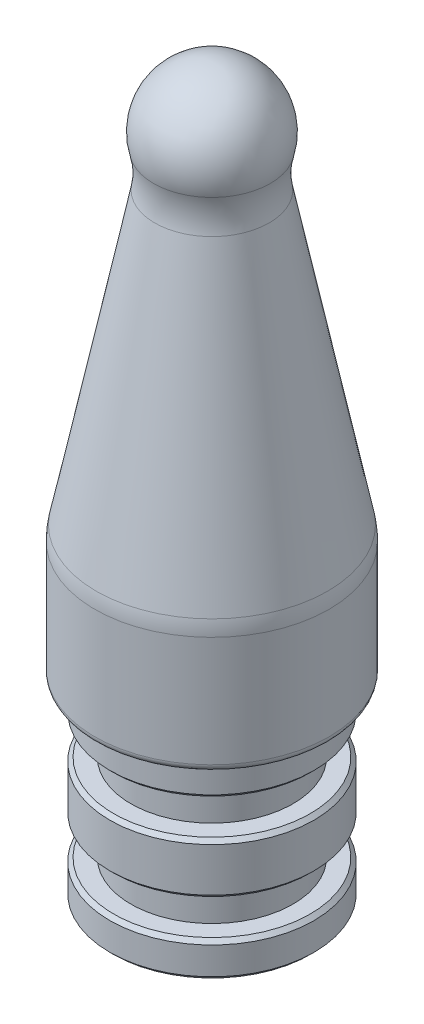
ISO-10303-21;
HEADER;
FILE_DESCRIPTION(('STEP AP214'),'2;1');
FILE_NAME('part.step','',(''),(''),'','','');
FILE_SCHEMA(('AUTOMOTIVE_DESIGN { 1 0 10303 214 1 1 1 1 }'));
ENDSEC;
DATA;
#1=APPLICATION_CONTEXT('core data for automotive mechanical design processes');
#2=APPLICATION_PROTOCOL_DEFINITION('international standard','automotive_design',2000,#1);
#3=PRODUCT_CONTEXT('',#1,'mechanical');
#4=PRODUCT('Part','Part','',(#3));
#5=PRODUCT_RELATED_PRODUCT_CATEGORY('part','',(#4));
#6=PRODUCT_DEFINITION_FORMATION('','',#4);
#7=PRODUCT_DEFINITION_CONTEXT('part definition',#1,'design');
#8=PRODUCT_DEFINITION('design','',#6,#7);
#9=PRODUCT_DEFINITION_SHAPE('','',#8);
#10=(LENGTH_UNIT() NAMED_UNIT(*) SI_UNIT(.MILLI.,.METRE.));
#11=(NAMED_UNIT(*) PLANE_ANGLE_UNIT() SI_UNIT($,.RADIAN.));
#12=(NAMED_UNIT(*) SI_UNIT($,.STERADIAN.) SOLID_ANGLE_UNIT());
#13=UNCERTAINTY_MEASURE_WITH_UNIT(LENGTH_MEASURE(1.E-05),#10,'distance_accuracy_value','');
#14=(GEOMETRIC_REPRESENTATION_CONTEXT(3) GLOBAL_UNCERTAINTY_ASSIGNED_CONTEXT((#13)) GLOBAL_UNIT_ASSIGNED_CONTEXT((#10,
#11,#12)) REPRESENTATION_CONTEXT('',''));
#15=CARTESIAN_POINT('',(0.,0.,0.));
#16=DIRECTION('',(0.,0.,1.));
#17=DIRECTION('',(1.,0.,0.));
#18=AXIS2_PLACEMENT_3D('',#15,#16,#17);
#19=CARTESIAN_POINT('',(0.,0.,0.));
#20=DIRECTION('',(0.,1.,0.));
#21=DIRECTION('',(0.,0.,1.));
#22=AXIS2_PLACEMENT_3D('',#19,#20,#21);
#23=PLANE('',#22);
#24=CARTESIAN_POINT('',(0.,0.,0.));
#25=DIRECTION('',(0.,1.,0.));
#26=DIRECTION('',(0.,0.,1.));
#27=AXIS2_PLACEMENT_3D('',#24,#25,#26);
#28=CIRCLE('',#27,13.);
#29=CARTESIAN_POINT('',(0.,0.,13.));
#30=VERTEX_POINT('',#29);
#31=EDGE_CURVE('E71',#30,#30,#28,.F.);
#32=ORIENTED_EDGE('',*,*,#31,.T.);
#33=EDGE_LOOP('',(#32));
#34=FACE_BOUND('',#33,.T.);
#35=CARTESIAN_POINT('',(0.,0.,0.));
#36=DIRECTION('',(0.,-1.,0.));
#37=DIRECTION('',(0.,0.,-1.));
#38=AXIS2_PLACEMENT_3D('',#35,#36,#37);
#39=CIRCLE('',#38,2.09999999999999);
#40=CARTESIAN_POINT('',(0.,0.,-2.09999999999999));
#41=VERTEX_POINT('',#40);
#42=EDGE_CURVE('E119',#41,#41,#39,.T.);
#43=ORIENTED_EDGE('',*,*,#42,.F.);
#44=EDGE_LOOP('',(#43));
#45=FACE_BOUND('',#44,.T.);
#46=ADVANCED_FACE('F45',(#34,#45),#23,.F.);
#47=CARTESIAN_POINT('',(0.,-29.1154086371947,0.));
#48=DIRECTION('',(0.,-1.,0.));
#49=DIRECTION('',(0.,0.,-1.));
#50=AXIS2_PLACEMENT_3D('',#47,#48,#49);
#51=CYLINDRICAL_SURFACE('',#50,13.5);
#52=CARTESIAN_POINT('',(0.,21.34,0.));
#53=DIRECTION('',(0.,1.,0.));
#54=DIRECTION('',(0.,0.,1.));
#55=AXIS2_PLACEMENT_3D('',#52,#53,#54);
#56=CIRCLE('',#55,13.5);
#57=CARTESIAN_POINT('',(0.,21.34,13.5));
#58=VERTEX_POINT('',#57);
#59=EDGE_CURVE('E95',#58,#58,#56,.T.);
#60=ORIENTED_EDGE('',*,*,#59,.T.);
#61=EDGE_LOOP('',(#60));
#62=FACE_BOUND('',#61,.T.);
#63=CARTESIAN_POINT('',(0.,25.1999999999997,0.));
#64=DIRECTION('',(0.,-1.,0.));
#65=DIRECTION('',(1.,0.,0.));
#66=AXIS2_PLACEMENT_3D('',#63,#64,#65);
#67=CIRCLE('',#66,13.5);
#68=CARTESIAN_POINT('',(13.5,25.1999999999997,0.));
#69=VERTEX_POINT('',#68);
#70=EDGE_CURVE('E113',#69,#69,#67,.T.);
#71=ORIENTED_EDGE('',*,*,#70,.T.);
#72=EDGE_LOOP('',(#71));
#73=FACE_BOUND('',#72,.T.);
#74=ADVANCED_FACE('F126',(#62,#73),#51,.T.);
#75=CARTESIAN_POINT('',(-13.5,20.84,0.));
#76=DIRECTION('',(0.,1.,0.));
#77=DIRECTION('',(0.,0.,1.));
#78=AXIS2_PLACEMENT_3D('',#75,#76,#77);
#79=PLANE('',#78);
#80=CARTESIAN_POINT('',(0.,20.84,0.));
#81=DIRECTION('',(0.,1.,0.));
#82=DIRECTION('',(0.,0.,1.));
#83=AXIS2_PLACEMENT_3D('',#80,#81,#82);
#84=CIRCLE('',#83,13.);
#85=CARTESIAN_POINT('',(0.,20.84,13.));
#86=VERTEX_POINT('',#85);
#87=EDGE_CURVE('E98',#86,#86,#84,.F.);
#88=ORIENTED_EDGE('',*,*,#87,.T.);
#89=EDGE_LOOP('',(#88));
#90=FACE_BOUND('',#89,.T.);
#91=CARTESIAN_POINT('',(0.,20.84,0.));
#92=DIRECTION('',(0.,-1.,0.));
#93=DIRECTION('',(0.,0.,-1.));
#94=AXIS2_PLACEMENT_3D('',#91,#92,#93);
#95=CIRCLE('',#94,10.73);
#96=CARTESIAN_POINT('',(0.,20.84,-10.73));
#97=VERTEX_POINT('',#96);
#98=EDGE_CURVE('E101',#97,#97,#95,.T.);
#99=ORIENTED_EDGE('',*,*,#98,.F.);
#100=EDGE_LOOP('',(#99));
#101=FACE_BOUND('',#100,.T.);
#102=ADVANCED_FACE('F132',(#90,#101),#79,.F.);
#103=CARTESIAN_POINT('',(0.,-29.1154086371947,0.));
#104=DIRECTION('',(0.,-1.,0.));
#105=DIRECTION('',(0.,0.,-1.));
#106=AXIS2_PLACEMENT_3D('',#103,#104,#105);
#107=CYLINDRICAL_SURFACE('',#106,10.73);
#108=CARTESIAN_POINT('',(0.,16.14,0.));
#109=DIRECTION('',(0.,-1.,0.));
#110=DIRECTION('',(0.,0.,-1.));
#111=AXIS2_PLACEMENT_3D('',#108,#109,#110);
#112=CIRCLE('',#111,10.73);
#113=CARTESIAN_POINT('',(0.,16.14,-10.73));
#114=VERTEX_POINT('',#113);
#115=EDGE_CURVE('E104',#114,#114,#112,.T.);
#116=ORIENTED_EDGE('',*,*,#115,.F.);
#117=EDGE_LOOP('',(#116));
#118=FACE_BOUND('',#117,.T.);
#119=ORIENTED_EDGE('',*,*,#98,.T.);
#120=EDGE_LOOP('',(#119));
#121=FACE_BOUND('',#120,.T.);
#122=ADVANCED_FACE('F163',(#118,#121),#107,.T.);
#123=CARTESIAN_POINT('',(-10.73,16.14,0.));
#124=DIRECTION('',(0.,-1.,0.));
#125=DIRECTION('',(0.,0.,-1.));
#126=AXIS2_PLACEMENT_3D('',#123,#124,#125);
#127=PLANE('',#126);
#128=CARTESIAN_POINT('',(0.,16.14,0.));
#129=DIRECTION('',(0.,-1.,0.));
#130=DIRECTION('',(0.,0.,-1.));
#131=AXIS2_PLACEMENT_3D('',#128,#129,#130);
#132=CIRCLE('',#131,13.);
#133=CARTESIAN_POINT('',(0.,16.14,-13.));
#134=VERTEX_POINT('',#133);
#135=EDGE_CURVE('E86',#134,#134,#132,.F.);
#136=ORIENTED_EDGE('',*,*,#135,.T.);
#137=EDGE_LOOP('',(#136));
#138=FACE_BOUND('',#137,.T.);
#139=ORIENTED_EDGE('',*,*,#115,.T.);
#140=EDGE_LOOP('',(#139));
#141=FACE_BOUND('',#140,.T.);
#142=ADVANCED_FACE('F159',(#138,#141),#127,.F.);
#143=CARTESIAN_POINT('',(0.,-29.1154086371947,0.));
#144=DIRECTION('',(0.,-1.,0.));
#145=DIRECTION('',(0.,0.,-1.));
#146=AXIS2_PLACEMENT_3D('',#143,#144,#145);
#147=CYLINDRICAL_SURFACE('',#146,13.5);
#148=CARTESIAN_POINT('',(0.,15.64,0.));
#149=DIRECTION('',(0.,-1.,0.));
#150=DIRECTION('',(0.,0.,-1.));
#151=AXIS2_PLACEMENT_3D('',#148,#149,#150);
#152=CIRCLE('',#151,13.5);
#153=CARTESIAN_POINT('',(0.,15.64,-13.5));
#154=VERTEX_POINT('',#153);
#155=EDGE_CURVE('E89',#154,#154,#152,.T.);
#156=ORIENTED_EDGE('',*,*,#155,.T.);
#157=EDGE_LOOP('',(#156));
#158=FACE_BOUND('',#157,.T.);
#159=CARTESIAN_POINT('',(0.,9.83999999999999,0.));
#160=DIRECTION('',(0.,1.,0.));
#161=DIRECTION('',(0.,0.,1.));
#162=AXIS2_PLACEMENT_3D('',#159,#160,#161);
#163=CIRCLE('',#162,13.5);
#164=CARTESIAN_POINT('',(0.,9.83999999999999,13.5));
#165=VERTEX_POINT('',#164);
#166=EDGE_CURVE('E92',#165,#165,#163,.T.);
#167=ORIENTED_EDGE('',*,*,#166,.T.);
#168=EDGE_LOOP('',(#167));
#169=FACE_BOUND('',#168,.T.);
#170=ADVANCED_FACE('F155',(#158,#169),#147,.T.);
#171=CARTESIAN_POINT('',(-13.5,9.34,0.));
#172=DIRECTION('',(0.,1.,0.));
#173=DIRECTION('',(0.,0.,1.));
#174=AXIS2_PLACEMENT_3D('',#171,#172,#173);
#175=PLANE('',#174);
#176=CARTESIAN_POINT('',(0.,9.34,0.));
#177=DIRECTION('',(0.,1.,0.));
#178=DIRECTION('',(0.,0.,1.));
#179=AXIS2_PLACEMENT_3D('',#176,#177,#178);
#180=CIRCLE('',#179,13.);
#181=CARTESIAN_POINT('',(0.,9.34,13.));
#182=VERTEX_POINT('',#181);
#183=EDGE_CURVE('E83',#182,#182,#180,.F.);
#184=ORIENTED_EDGE('',*,*,#183,.T.);
#185=EDGE_LOOP('',(#184));
#186=FACE_BOUND('',#185,.T.);
#187=CARTESIAN_POINT('',(0.,9.33999999999999,0.));
#188=DIRECTION('',(0.,-1.,0.));
#189=DIRECTION('',(0.,0.,-1.));
#190=AXIS2_PLACEMENT_3D('',#187,#188,#189);
#191=CIRCLE('',#190,10.73);
#192=CARTESIAN_POINT('',(0.,9.33999999999999,-10.73));
#193=VERTEX_POINT('',#192);
#194=EDGE_CURVE('E107',#193,#193,#191,.T.);
#195=ORIENTED_EDGE('',*,*,#194,.F.);
#196=EDGE_LOOP('',(#195));
#197=FACE_BOUND('',#196,.T.);
#198=ADVANCED_FACE('F151',(#186,#197),#175,.F.);
#199=CARTESIAN_POINT('',(0.,-29.1154086371947,0.));
#200=DIRECTION('',(0.,-1.,0.));
#201=DIRECTION('',(0.,0.,-1.));
#202=AXIS2_PLACEMENT_3D('',#199,#200,#201);
#203=CYLINDRICAL_SURFACE('',#202,10.73);
#204=CARTESIAN_POINT('',(0.,4.64,0.));
#205=DIRECTION('',(0.,-1.,0.));
#206=DIRECTION('',(0.,0.,-1.));
#207=AXIS2_PLACEMENT_3D('',#204,#205,#206);
#208=CIRCLE('',#207,10.73);
#209=CARTESIAN_POINT('',(0.,4.64,-10.73));
#210=VERTEX_POINT('',#209);
#211=EDGE_CURVE('E110',#210,#210,#208,.T.);
#212=ORIENTED_EDGE('',*,*,#211,.F.);
#213=EDGE_LOOP('',(#212));
#214=FACE_BOUND('',#213,.T.);
#215=ORIENTED_EDGE('',*,*,#194,.T.);
#216=EDGE_LOOP('',(#215));
#217=FACE_BOUND('',#216,.T.);
#218=ADVANCED_FACE('F147',(#214,#217),#203,.T.);
#219=CARTESIAN_POINT('',(-10.73,4.64,0.));
#220=DIRECTION('',(0.,-1.,0.));
#221=DIRECTION('',(0.,0.,-1.));
#222=AXIS2_PLACEMENT_3D('',#219,#220,#221);
#223=PLANE('',#222);
#224=CARTESIAN_POINT('',(0.,4.64,0.));
#225=DIRECTION('',(0.,-1.,0.));
#226=DIRECTION('',(0.,0.,-1.));
#227=AXIS2_PLACEMENT_3D('',#224,#225,#226);
#228=CIRCLE('',#227,13.);
#229=CARTESIAN_POINT('',(0.,4.64,-13.));
#230=VERTEX_POINT('',#229);
#231=EDGE_CURVE('E74',#230,#230,#228,.F.);
#232=ORIENTED_EDGE('',*,*,#231,.T.);
#233=EDGE_LOOP('',(#232));
#234=FACE_BOUND('',#233,.T.);
#235=ORIENTED_EDGE('',*,*,#211,.T.);
#236=EDGE_LOOP('',(#235));
#237=FACE_BOUND('',#236,.T.);
#238=ADVANCED_FACE('F143',(#234,#237),#223,.F.);
#239=CARTESIAN_POINT('',(0.,-29.1154086371947,0.));
#240=DIRECTION('',(0.,-1.,0.));
#241=DIRECTION('',(0.,0.,-1.));
#242=AXIS2_PLACEMENT_3D('',#239,#240,#241);
#243=CYLINDRICAL_SURFACE('',#242,13.5);
#244=CARTESIAN_POINT('',(0.,4.14,0.));
#245=DIRECTION('',(0.,-1.,0.));
#246=DIRECTION('',(0.,0.,-1.));
#247=AXIS2_PLACEMENT_3D('',#244,#245,#246);
#248=CIRCLE('',#247,13.5);
#249=CARTESIAN_POINT('',(0.,4.14,-13.5));
#250=VERTEX_POINT('',#249);
#251=EDGE_CURVE('E77',#250,#250,#248,.T.);
#252=ORIENTED_EDGE('',*,*,#251,.T.);
#253=EDGE_LOOP('',(#252));
#254=FACE_BOUND('',#253,.T.);
#255=CARTESIAN_POINT('',(0.,0.500000000000007,0.));
#256=DIRECTION('',(0.,1.,0.));
#257=DIRECTION('',(0.,0.,1.));
#258=AXIS2_PLACEMENT_3D('',#255,#256,#257);
#259=CIRCLE('',#258,13.5);
#260=CARTESIAN_POINT('',(0.,0.500000000000007,13.5));
#261=VERTEX_POINT('',#260);
#262=EDGE_CURVE('E80',#261,#261,#259,.T.);
#263=ORIENTED_EDGE('',*,*,#262,.T.);
#264=EDGE_LOOP('',(#263));
#265=FACE_BOUND('',#264,.T.);
#266=ADVANCED_FACE('F139',(#254,#265),#243,.T.);
#267=CARTESIAN_POINT('',(0.,20.84,0.));
#268=DIRECTION('',(0.,1.,0.));
#269=DIRECTION('',(0.,0.,1.));
#270=AXIS2_PLACEMENT_3D('',#267,#268,#269);
#271=CONICAL_SURFACE('',#270,13.,0.785398163397441);
#272=ORIENTED_EDGE('',*,*,#59,.F.);
#273=EDGE_LOOP('',(#272));
#274=FACE_BOUND('',#273,.T.);
#275=ORIENTED_EDGE('',*,*,#87,.F.);
#276=EDGE_LOOP('',(#275));
#277=FACE_BOUND('',#276,.T.);
#278=ADVANCED_FACE('F142',(#274,#277),#271,.T.);
#279=CARTESIAN_POINT('',(0.,15.64,0.));
#280=DIRECTION('',(0.,-1.,0.));
#281=DIRECTION('',(0.,0.,-1.));
#282=AXIS2_PLACEMENT_3D('',#279,#280,#281);
#283=CONICAL_SURFACE('',#282,13.5,0.785398163397452);
#284=ORIENTED_EDGE('',*,*,#135,.F.);
#285=EDGE_LOOP('',(#284));
#286=FACE_BOUND('',#285,.T.);
#287=ORIENTED_EDGE('',*,*,#155,.F.);
#288=EDGE_LOOP('',(#287));
#289=FACE_BOUND('',#288,.T.);
#290=ADVANCED_FACE('F177',(#286,#289),#283,.T.);
#291=CARTESIAN_POINT('',(0.,9.33999999999999,0.));
#292=DIRECTION('',(0.,1.,0.));
#293=DIRECTION('',(0.,0.,1.));
#294=AXIS2_PLACEMENT_3D('',#291,#292,#293);
#295=CONICAL_SURFACE('',#294,13.,0.785398163397445);
#296=ORIENTED_EDGE('',*,*,#166,.F.);
#297=EDGE_LOOP('',(#296));
#298=FACE_BOUND('',#297,.T.);
#299=ORIENTED_EDGE('',*,*,#183,.F.);
#300=EDGE_LOOP('',(#299));
#301=FACE_BOUND('',#300,.T.);
#302=ADVANCED_FACE('F184',(#298,#301),#295,.T.);
#303=CARTESIAN_POINT('',(0.,4.14,0.));
#304=DIRECTION('',(0.,-1.,0.));
#305=DIRECTION('',(0.,0.,-1.));
#306=AXIS2_PLACEMENT_3D('',#303,#304,#305);
#307=CONICAL_SURFACE('',#306,13.5,0.785398163397448);
#308=ORIENTED_EDGE('',*,*,#231,.F.);
#309=EDGE_LOOP('',(#308));
#310=FACE_BOUND('',#309,.T.);
#311=ORIENTED_EDGE('',*,*,#251,.F.);
#312=EDGE_LOOP('',(#311));
#313=FACE_BOUND('',#312,.T.);
#314=ADVANCED_FACE('F191',(#310,#313),#307,.T.);
#315=CARTESIAN_POINT('',(0.,0.,0.));
#316=DIRECTION('',(0.,1.,0.));
#317=DIRECTION('',(0.,0.,1.));
#318=AXIS2_PLACEMENT_3D('',#315,#316,#317);
#319=CONICAL_SURFACE('',#318,13.,0.785398163397445);
#320=ORIENTED_EDGE('',*,*,#262,.F.);
#321=EDGE_LOOP('',(#320));
#322=FACE_BOUND('',#321,.T.);
#323=ORIENTED_EDGE('',*,*,#31,.F.);
#324=EDGE_LOOP('',(#323));
#325=FACE_BOUND('',#324,.T.);
#326=ADVANCED_FACE('F198',(#322,#325),#319,.T.);
#327=CARTESIAN_POINT('',(0.,95.8,0.));
#328=DIRECTION('',(0.,1.,0.));
#329=DIRECTION('',(-1.,0.,0.));
#330=AXIS2_PLACEMENT_3D('',#327,#328,#329);
#331=CYLINDRICAL_SURFACE('',#330,15.5);
#332=CARTESIAN_POINT('',(0.,26.1999999999997,0.));
#333=DIRECTION('',(0.,-1.,0.));
#334=DIRECTION('',(1.,0.,0.));
#335=AXIS2_PLACEMENT_3D('',#332,#333,#334);
#336=CIRCLE('',#335,15.5);
#337=CARTESIAN_POINT('',(15.5,26.1999999999997,0.));
#338=VERTEX_POINT('',#337);
#339=EDGE_CURVE('E52',#338,#338,#336,.F.);
#340=ORIENTED_EDGE('',*,*,#339,.T.);
#341=EDGE_LOOP('',(#340));
#342=FACE_BOUND('',#341,.T.);
#343=CARTESIAN_POINT('',(0.,40.8012103510305,0.));
#344=DIRECTION('',(0.,-1.,0.));
#345=DIRECTION('',(1.,0.,0.));
#346=AXIS2_PLACEMENT_3D('',#343,#344,#345);
#347=CIRCLE('',#346,15.5);
#348=CARTESIAN_POINT('',(15.5,40.8012103510305,0.));
#349=VERTEX_POINT('',#348);
#350=EDGE_CURVE('E56',#349,#349,#347,.T.);
#351=ORIENTED_EDGE('',*,*,#350,.T.);
#352=EDGE_LOOP('',(#351));
#353=FACE_BOUND('',#352,.T.);
#354=ADVANCED_FACE('F137',(#342,#353),#331,.T.);
#355=CARTESIAN_POINT('',(-12.5,25.1999999999997,0.));
#356=DIRECTION('',(0.,-1.,0.));
#357=DIRECTION('',(1.,0.,0.));
#358=AXIS2_PLACEMENT_3D('',#355,#356,#357);
#359=PLANE('',#358);
#360=CARTESIAN_POINT('',(0.,25.1999999999997,0.));
#361=DIRECTION('',(0.,-1.,0.));
#362=DIRECTION('',(1.,0.,0.));
#363=AXIS2_PLACEMENT_3D('',#360,#361,#362);
#364=CIRCLE('',#363,14.5);
#365=CARTESIAN_POINT('',(14.5,25.1999999999997,0.));
#366=VERTEX_POINT('',#365);
#367=EDGE_CURVE('E10',#366,#366,#364,.T.);
#368=ORIENTED_EDGE('',*,*,#367,.T.);
#369=EDGE_LOOP('',(#368));
#370=FACE_BOUND('',#369,.T.);
#371=ORIENTED_EDGE('',*,*,#70,.F.);
#372=EDGE_LOOP('',(#371));
#373=FACE_BOUND('',#372,.T.);
#374=ADVANCED_FACE('F228',(#370,#373),#359,.T.);
#375=CARTESIAN_POINT('',(0.,87.8,0.));
#376=DIRECTION('',(0.,1.,0.));
#377=DIRECTION('',(1.,0.,0.));
#378=AXIS2_PLACEMENT_3D('',#375,#376,#377);
#379=SPHERICAL_SURFACE('',#378,8.);
#380=CARTESIAN_POINT('',(0.,85.7043765452389,0.));
#381=DIRECTION('',(0.,1.,0.));
#382=DIRECTION('',(-1.,0.,0.));
#383=AXIS2_PLACEMENT_3D('',#380,#381,#382);
#384=CIRCLE('',#383,7.72064520204466);
#385=CARTESIAN_POINT('',(-7.72064520204466,85.7043765452389,0.));
#386=VERTEX_POINT('',#385);
#387=EDGE_CURVE('E68',#386,#386,#384,.T.);
#388=ORIENTED_EDGE('',*,*,#387,.T.);
#389=EDGE_LOOP('',(#388));
#390=FACE_BOUND('',#389,.T.);
#391=ADVANCED_FACE('F222',(#390),#379,.T.);
#392=CARTESIAN_POINT('',(0.,83.9270166537926,0.));
#393=DIRECTION('',(0.,-1.,0.));
#394=DIRECTION('',(1.,0.,0.));
#395=AXIS2_PLACEMENT_3D('',#392,#393,#394);
#396=CONICAL_SURFACE('',#395,7.,0.199097628639875);
#397=CARTESIAN_POINT('',(0.,81.1069985666017,0.));
#398=DIRECTION('',(0.,-1.,0.));
#399=DIRECTION('',(1.,0.,0.));
#400=AXIS2_PLACEMENT_3D('',#397,#398,#399);
#401=CIRCLE('',#400,7.56899718150264);
#402=CARTESIAN_POINT('',(7.56899718150264,81.1069985666017,0.));
#403=VERTEX_POINT('',#402);
#404=EDGE_CURVE('E60',#403,#403,#401,.T.);
#405=ORIENTED_EDGE('',*,*,#404,.T.);
#406=EDGE_LOOP('',(#405));
#407=FACE_BOUND('',#406,.T.);
#408=CARTESIAN_POINT('',(0.,42.7790590112164,0.));
#409=DIRECTION('',(0.,1.,0.));
#410=DIRECTION('',(-1.,0.,0.));
#411=AXIS2_PLACEMENT_3D('',#408,#409,#410);
#412=CIRCLE('',#411,15.3024545230978);
#413=CARTESIAN_POINT('',(-15.3024545230978,42.7790590112164,0.));
#414=VERTEX_POINT('',#413);
#415=EDGE_CURVE('E65',#414,#414,#412,.T.);
#416=ORIENTED_EDGE('',*,*,#415,.T.);
#417=EDGE_LOOP('',(#416));
#418=FACE_BOUND('',#417,.T.);
#419=ADVANCED_FACE('F208',(#407,#418),#396,.T.);
#420=CARTESIAN_POINT('',(0.,83.0848472267875,0.));
#421=DIRECTION('',(0.,1.,0.));
#422=DIRECTION('',(-1.,0.,0.));
#423=AXIS2_PLACEMENT_3D('',#420,#421,#422);
#424=TOROIDAL_SURFACE('',#423,17.3714517046005,10.);
#425=ORIENTED_EDGE('',*,*,#404,.F.);
#426=EDGE_LOOP('',(#425));
#427=FACE_BOUND('',#426,.T.);
#428=ORIENTED_EDGE('',*,*,#387,.F.);
#429=EDGE_LOOP('',(#428));
#430=FACE_BOUND('',#429,.T.);
#431=ADVANCED_FACE('F205',(#427,#430),#424,.F.);
#432=CARTESIAN_POINT('',(0.,40.8012103510305,0.));
#433=DIRECTION('',(0.,-1.,0.));
#434=DIRECTION('',(1.,0.,0.));
#435=AXIS2_PLACEMENT_3D('',#432,#433,#434);
#436=DEGENERATE_TOROIDAL_SURFACE('',#435,5.5,10.,.T.);
#437=ORIENTED_EDGE('',*,*,#350,.F.);
#438=EDGE_LOOP('',(#437));
#439=FACE_BOUND('',#438,.T.);
#440=ORIENTED_EDGE('',*,*,#415,.F.);
#441=EDGE_LOOP('',(#440));
#442=FACE_BOUND('',#441,.T.);
#443=ADVANCED_FACE('F207',(#439,#442),#436,.T.);
#444=CARTESIAN_POINT('',(0.,26.1999999999997,0.));
#445=DIRECTION('',(0.,-1.,0.));
#446=DIRECTION('',(1.,0.,0.));
#447=AXIS2_PLACEMENT_3D('',#444,#445,#446);
#448=TOROIDAL_SURFACE('',#447,14.5,1.);
#449=ORIENTED_EDGE('',*,*,#367,.F.);
#450=EDGE_LOOP('',(#449));
#451=FACE_BOUND('',#450,.T.);
#452=ORIENTED_EDGE('',*,*,#339,.F.);
#453=EDGE_LOOP('',(#452));
#454=FACE_BOUND('',#453,.T.);
#455=ADVANCED_FACE('F47',(#451,#454),#448,.T.);
#456=CARTESIAN_POINT('',(0.,14.,0.));
#457=DIRECTION('',(0.,1.,0.));
#458=DIRECTION('',(0.,0.,1.));
#459=AXIS2_PLACEMENT_3D('',#456,#457,#458);
#460=PLANE('',#459);
#461=CARTESIAN_POINT('',(0.,14.,0.));
#462=DIRECTION('',(0.,-1.,0.));
#463=DIRECTION('',(0.,0.,-1.));
#464=AXIS2_PLACEMENT_3D('',#461,#462,#463);
#465=CIRCLE('',#464,2.09999999999999);
#466=CARTESIAN_POINT('',(0.,14.,-2.09999999999999));
#467=VERTEX_POINT('',#466);
#468=EDGE_CURVE('E116',#467,#467,#465,.T.);
#469=ORIENTED_EDGE('',*,*,#468,.T.);
#470=EDGE_LOOP('',(#469));
#471=FACE_BOUND('',#470,.T.);
#472=ADVANCED_FACE('F215',(#471),#460,.F.);
#473=CARTESIAN_POINT('',(0.,0.,0.));
#474=DIRECTION('',(0.,-1.,0.));
#475=DIRECTION('',(0.,0.,-1.));
#476=AXIS2_PLACEMENT_3D('',#473,#474,#475);
#477=CYLINDRICAL_SURFACE('',#476,2.09999999999999);
#478=ORIENTED_EDGE('',*,*,#468,.F.);
#479=EDGE_LOOP('',(#478));
#480=FACE_BOUND('',#479,.T.);
#481=ORIENTED_EDGE('',*,*,#42,.T.);
#482=EDGE_LOOP('',(#481));
#483=FACE_BOUND('',#482,.T.);
#484=ADVANCED_FACE('F123',(#480,#483),#477,.F.);
#485=CLOSED_SHELL('',(#46,#74,#102,#122,#142,#170,#198,#218,#238,#266,#278,#290,#302,#314,#326,
#354,#374,#391,#419,#431,#443,#455,#472,#484));
#486=MANIFOLD_SOLID_BREP('B2',#485);
#487=ADVANCED_BREP_SHAPE_REPRESENTATION('',(#18,#486),#14);
#488=SHAPE_DEFINITION_REPRESENTATION(#9,#487);
ENDSEC;
END-ISO-10303-21;
